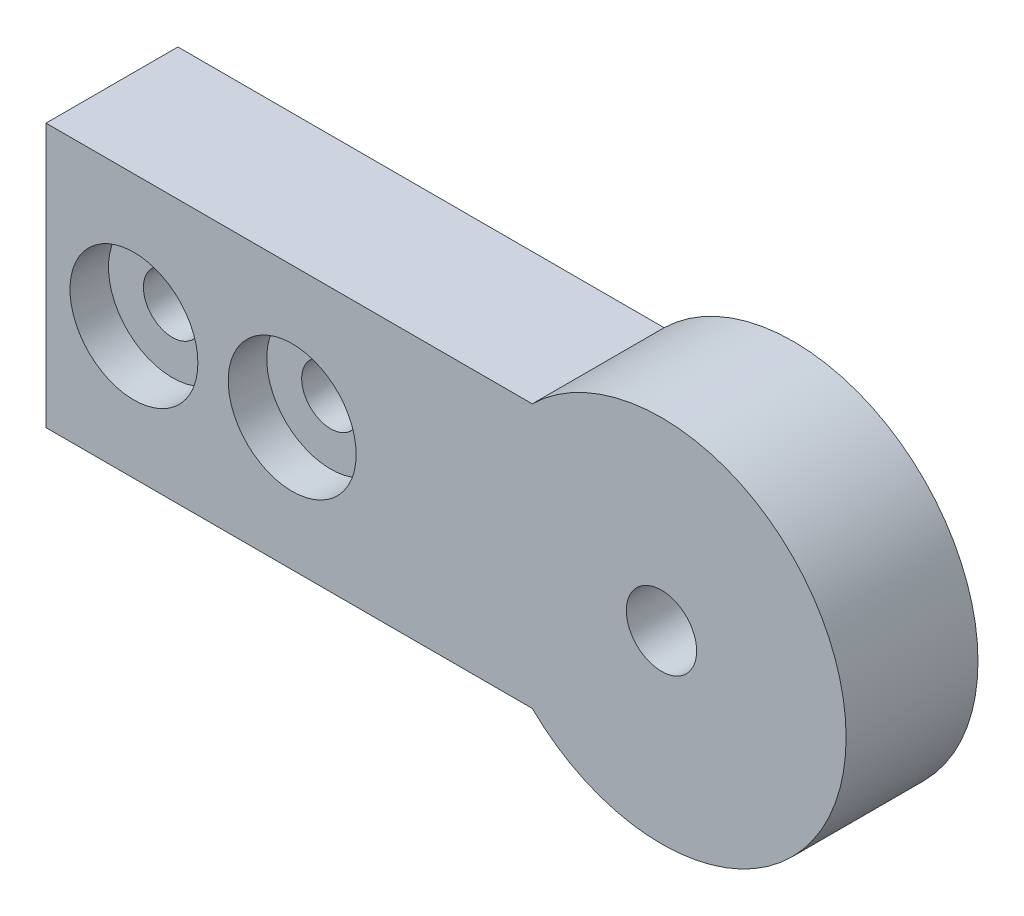
ISO-10303-21;
HEADER;
FILE_DESCRIPTION(('STEP AP214'),'2;1');
FILE_NAME('part.step','',(''),(''),'','','');
FILE_SCHEMA(('AUTOMOTIVE_DESIGN { 1 0 10303 214 1 1 1 1 }'));
ENDSEC;
DATA;
#1=APPLICATION_CONTEXT('core data for automotive mechanical design processes');
#2=APPLICATION_PROTOCOL_DEFINITION('international standard','automotive_design',2000,#1);
#3=PRODUCT_CONTEXT('',#1,'mechanical');
#4=PRODUCT('Part','Part','',(#3));
#5=PRODUCT_RELATED_PRODUCT_CATEGORY('part','',(#4));
#6=PRODUCT_DEFINITION_FORMATION('','',#4);
#7=PRODUCT_DEFINITION_CONTEXT('part definition',#1,'design');
#8=PRODUCT_DEFINITION('design','',#6,#7);
#9=PRODUCT_DEFINITION_SHAPE('','',#8);
#10=(LENGTH_UNIT() NAMED_UNIT(*) SI_UNIT(.MILLI.,.METRE.));
#11=(NAMED_UNIT(*) PLANE_ANGLE_UNIT() SI_UNIT($,.RADIAN.));
#12=(NAMED_UNIT(*) SI_UNIT($,.STERADIAN.) SOLID_ANGLE_UNIT());
#13=UNCERTAINTY_MEASURE_WITH_UNIT(LENGTH_MEASURE(1.E-05),#10,'distance_accuracy_value','');
#14=(GEOMETRIC_REPRESENTATION_CONTEXT(3) GLOBAL_UNCERTAINTY_ASSIGNED_CONTEXT((#13)) GLOBAL_UNIT_ASSIGNED_CONTEXT((#10,
#11,#12)) REPRESENTATION_CONTEXT('',''));
#15=CARTESIAN_POINT('',(0.,0.,0.));
#16=DIRECTION('',(0.,0.,1.));
#17=DIRECTION('',(1.,0.,0.));
#18=AXIS2_PLACEMENT_3D('',#15,#16,#17);
#19=CARTESIAN_POINT('',(0.,0.,15.));
#20=DIRECTION('',(0.,0.,-1.));
#21=DIRECTION('',(-1.,0.,0.));
#22=AXIS2_PLACEMENT_3D('',#19,#20,#21);
#23=CYLINDRICAL_SURFACE('',#22,21.);
#24=CARTESIAN_POINT('',(0.,0.,0.));
#25=DIRECTION('',(0.,0.,1.));
#26=DIRECTION('',(1.,0.,0.));
#27=AXIS2_PLACEMENT_3D('',#24,#25,#26);
#28=CIRCLE('',#27,21.);
#29=CARTESIAN_POINT('',(-14.6969384566991,-15.,0.));
#30=VERTEX_POINT('',#29);
#31=CARTESIAN_POINT('',(-14.6969384566991,15.,0.));
#32=VERTEX_POINT('',#31);
#33=EDGE_CURVE('E110',#30,#32,#28,.T.);
#34=ORIENTED_EDGE('',*,*,#33,.T.);
#35=DIRECTION('',(0.,0.,-1.));
#36=VECTOR('',#35,1.);
#37=CARTESIAN_POINT('',(-14.6969384566991,15.,15.));
#38=LINE('',#37,#36);
#39=CARTESIAN_POINT('',(-14.6969384566991,15.,15.));
#40=VERTEX_POINT('',#39);
#41=EDGE_CURVE('E11',#40,#32,#38,.T.);
#42=ORIENTED_EDGE('',*,*,#41,.F.);
#43=CARTESIAN_POINT('',(0.,0.,15.));
#44=DIRECTION('',(0.,0.,1.));
#45=DIRECTION('',(1.,0.,0.));
#46=AXIS2_PLACEMENT_3D('',#43,#44,#45);
#47=CIRCLE('',#46,21.);
#48=CARTESIAN_POINT('',(-14.6969384566991,-15.,15.));
#49=VERTEX_POINT('',#48);
#50=EDGE_CURVE('E94',#49,#40,#47,.T.);
#51=ORIENTED_EDGE('',*,*,#50,.F.);
#52=DIRECTION('',(0.,0.,-1.));
#53=VECTOR('',#52,1.);
#54=CARTESIAN_POINT('',(-14.6969384566991,-15.,15.));
#55=LINE('',#54,#53);
#56=EDGE_CURVE('E106',#49,#30,#55,.T.);
#57=ORIENTED_EDGE('',*,*,#56,.T.);
#58=EDGE_LOOP('',(#34,#42,#51,#57));
#59=FACE_BOUND('',#58,.T.);
#60=ADVANCED_FACE('F42',(#59),#23,.T.);
#61=CARTESIAN_POINT('',(-14.6969384566991,15.,15.));
#62=DIRECTION('',(0.,-1.,0.));
#63=DIRECTION('',(1.,0.,0.));
#64=AXIS2_PLACEMENT_3D('',#61,#62,#63);
#65=PLANE('',#64);
#66=DIRECTION('',(-1.,0.,0.));
#67=VECTOR('',#66,1.);
#68=CARTESIAN_POINT('',(-14.6969384566991,15.,0.));
#69=LINE('',#68,#67);
#70=CARTESIAN_POINT('',(-70.,15.,0.));
#71=VERTEX_POINT('',#70);
#72=EDGE_CURVE('E99',#32,#71,#69,.T.);
#73=ORIENTED_EDGE('',*,*,#72,.T.);
#74=DIRECTION('',(0.,0.,-1.));
#75=VECTOR('',#74,1.);
#76=CARTESIAN_POINT('',(-70.,15.,15.));
#77=LINE('',#76,#75);
#78=CARTESIAN_POINT('',(-70.,15.,15.));
#79=VERTEX_POINT('',#78);
#80=EDGE_CURVE('E51',#79,#71,#77,.T.);
#81=ORIENTED_EDGE('',*,*,#80,.F.);
#82=DIRECTION('',(-1.,0.,0.));
#83=VECTOR('',#82,1.);
#84=CARTESIAN_POINT('',(-14.6969384566991,15.,15.));
#85=LINE('',#84,#83);
#86=EDGE_CURVE('E89',#40,#79,#85,.T.);
#87=ORIENTED_EDGE('',*,*,#86,.F.);
#88=ORIENTED_EDGE('',*,*,#41,.T.);
#89=EDGE_LOOP('',(#73,#81,#87,#88));
#90=FACE_BOUND('',#89,.T.);
#91=ADVANCED_FACE('F98',(#90),#65,.F.);
#92=CARTESIAN_POINT('',(-70.,15.,15.));
#93=DIRECTION('',(1.,0.,0.));
#94=DIRECTION('',(0.,0.,-1.));
#95=AXIS2_PLACEMENT_3D('',#92,#93,#94);
#96=PLANE('',#95);
#97=DIRECTION('',(0.,-1.,0.));
#98=VECTOR('',#97,1.);
#99=CARTESIAN_POINT('',(-70.,15.,0.));
#100=LINE('',#99,#98);
#101=CARTESIAN_POINT('',(-70.,-15.,0.));
#102=VERTEX_POINT('',#101);
#103=EDGE_CURVE('E76',#71,#102,#100,.T.);
#104=ORIENTED_EDGE('',*,*,#103,.T.);
#105=DIRECTION('',(0.,0.,-1.));
#106=VECTOR('',#105,1.);
#107=CARTESIAN_POINT('',(-70.,-15.,15.));
#108=LINE('',#107,#106);
#109=CARTESIAN_POINT('',(-70.,-15.,15.));
#110=VERTEX_POINT('',#109);
#111=EDGE_CURVE('E101',#110,#102,#108,.T.);
#112=ORIENTED_EDGE('',*,*,#111,.F.);
#113=DIRECTION('',(0.,-1.,0.));
#114=VECTOR('',#113,1.);
#115=CARTESIAN_POINT('',(-70.,15.,15.));
#116=LINE('',#115,#114);
#117=EDGE_CURVE('E92',#79,#110,#116,.T.);
#118=ORIENTED_EDGE('',*,*,#117,.F.);
#119=ORIENTED_EDGE('',*,*,#80,.T.);
#120=EDGE_LOOP('',(#104,#112,#118,#119));
#121=FACE_BOUND('',#120,.T.);
#122=ADVANCED_FACE('F102',(#121),#96,.F.);
#123=CARTESIAN_POINT('',(-14.6969384566991,-15.,15.));
#124=DIRECTION('',(0.,1.,0.));
#125=DIRECTION('',(-1.,0.,0.));
#126=AXIS2_PLACEMENT_3D('',#123,#124,#125);
#127=PLANE('',#126);
#128=DIRECTION('',(1.,0.,0.));
#129=VECTOR('',#128,1.);
#130=CARTESIAN_POINT('',(-14.6969384566991,-15.,0.));
#131=LINE('',#130,#129);
#132=EDGE_CURVE('E82',#102,#30,#131,.T.);
#133=ORIENTED_EDGE('',*,*,#132,.T.);
#134=ORIENTED_EDGE('',*,*,#56,.F.);
#135=DIRECTION('',(1.,0.,0.));
#136=VECTOR('',#135,1.);
#137=CARTESIAN_POINT('',(-14.6969384566991,-15.,15.));
#138=LINE('',#137,#136);
#139=EDGE_CURVE('E59',#110,#49,#138,.T.);
#140=ORIENTED_EDGE('',*,*,#139,.F.);
#141=ORIENTED_EDGE('',*,*,#111,.T.);
#142=EDGE_LOOP('',(#133,#134,#140,#141));
#143=FACE_BOUND('',#142,.T.);
#144=ADVANCED_FACE('F124',(#143),#127,.F.);
#145=CARTESIAN_POINT('',(0.,0.,15.));
#146=DIRECTION('',(0.,0.,1.));
#147=DIRECTION('',(1.,0.,0.));
#148=AXIS2_PLACEMENT_3D('',#145,#146,#147);
#149=PLANE('',#148);
#150=CARTESIAN_POINT('',(0.,0.,15.));
#151=DIRECTION('',(0.,0.,1.));
#152=DIRECTION('',(1.,0.,0.));
#153=AXIS2_PLACEMENT_3D('',#150,#151,#152);
#154=CIRCLE('',#153,4.);
#155=CARTESIAN_POINT('',(4.,0.,15.));
#156=VERTEX_POINT('',#155);
#157=EDGE_CURVE('E166',#156,#156,#154,.T.);
#158=ORIENTED_EDGE('',*,*,#157,.F.);
#159=EDGE_LOOP('',(#158));
#160=FACE_BOUND('',#159,.T.);
#161=CARTESIAN_POINT('',(-60.,0.,15.));
#162=DIRECTION('',(0.,0.,1.));
#163=DIRECTION('',(1.,0.,0.));
#164=AXIS2_PLACEMENT_3D('',#161,#162,#163);
#165=CIRCLE('',#164,7.275);
#166=CARTESIAN_POINT('',(-52.725,0.,15.));
#167=VERTEX_POINT('',#166);
#168=EDGE_CURVE('E158',#167,#167,#165,.T.);
#169=ORIENTED_EDGE('',*,*,#168,.F.);
#170=EDGE_LOOP('',(#169));
#171=FACE_BOUND('',#170,.T.);
#172=CARTESIAN_POINT('',(-42.,0.,15.));
#173=DIRECTION('',(0.,0.,1.));
#174=DIRECTION('',(1.,0.,0.));
#175=AXIS2_PLACEMENT_3D('',#172,#173,#174);
#176=CIRCLE('',#175,7.275);
#177=CARTESIAN_POINT('',(-34.725,0.,15.));
#178=VERTEX_POINT('',#177);
#179=EDGE_CURVE('E142',#178,#178,#176,.T.);
#180=ORIENTED_EDGE('',*,*,#179,.F.);
#181=EDGE_LOOP('',(#180));
#182=FACE_BOUND('',#181,.T.);
#183=ORIENTED_EDGE('',*,*,#50,.T.);
#184=ORIENTED_EDGE('',*,*,#86,.T.);
#185=ORIENTED_EDGE('',*,*,#117,.T.);
#186=ORIENTED_EDGE('',*,*,#139,.T.);
#187=EDGE_LOOP('',(#183,#184,#185,#186));
#188=FACE_BOUND('',#187,.T.);
#189=ADVANCED_FACE('F90',(#160,#171,#182,#188),#149,.T.);
#190=CARTESIAN_POINT('',(0.,0.,0.));
#191=DIRECTION('',(0.,0.,1.));
#192=DIRECTION('',(1.,0.,0.));
#193=AXIS2_PLACEMENT_3D('',#190,#191,#192);
#194=PLANE('',#193);
#195=CARTESIAN_POINT('',(0.,0.,0.));
#196=DIRECTION('',(0.,0.,1.));
#197=DIRECTION('',(1.,0.,0.));
#198=AXIS2_PLACEMENT_3D('',#195,#196,#197);
#199=CIRCLE('',#198,4.);
#200=CARTESIAN_POINT('',(4.,0.,0.));
#201=VERTEX_POINT('',#200);
#202=EDGE_CURVE('E162',#201,#201,#199,.F.);
#203=ORIENTED_EDGE('',*,*,#202,.F.);
#204=EDGE_LOOP('',(#203));
#205=FACE_BOUND('',#204,.T.);
#206=CARTESIAN_POINT('',(-60.,0.,0.));
#207=DIRECTION('',(0.,0.,1.));
#208=DIRECTION('',(1.,0.,0.));
#209=AXIS2_PLACEMENT_3D('',#206,#207,#208);
#210=CIRCLE('',#209,3.3);
#211=CARTESIAN_POINT('',(-56.7,0.,0.));
#212=VERTEX_POINT('',#211);
#213=EDGE_CURVE('E146',#212,#212,#210,.T.);
#214=ORIENTED_EDGE('',*,*,#213,.T.);
#215=EDGE_LOOP('',(#214));
#216=FACE_BOUND('',#215,.T.);
#217=CARTESIAN_POINT('',(-42.,0.,0.));
#218=DIRECTION('',(0.,0.,1.));
#219=DIRECTION('',(1.,0.,0.));
#220=AXIS2_PLACEMENT_3D('',#217,#218,#219);
#221=CIRCLE('',#220,3.3);
#222=CARTESIAN_POINT('',(-38.7,0.,0.));
#223=VERTEX_POINT('',#222);
#224=EDGE_CURVE('E114',#223,#223,#221,.T.);
#225=ORIENTED_EDGE('',*,*,#224,.T.);
#226=EDGE_LOOP('',(#225));
#227=FACE_BOUND('',#226,.T.);
#228=ORIENTED_EDGE('',*,*,#33,.F.);
#229=ORIENTED_EDGE('',*,*,#132,.F.);
#230=ORIENTED_EDGE('',*,*,#103,.F.);
#231=ORIENTED_EDGE('',*,*,#72,.F.);
#232=EDGE_LOOP('',(#228,#229,#230,#231));
#233=FACE_BOUND('',#232,.T.);
#234=ADVANCED_FACE('F127',(#205,#216,#227,#233),#194,.F.);
#235=CARTESIAN_POINT('',(-42.,0.,15.));
#236=DIRECTION('',(0.,0.,1.));
#237=DIRECTION('',(1.,0.,0.));
#238=AXIS2_PLACEMENT_3D('',#235,#236,#237);
#239=CYLINDRICAL_SURFACE('',#238,3.3);
#240=ORIENTED_EDGE('',*,*,#224,.F.);
#241=EDGE_LOOP('',(#240));
#242=FACE_BOUND('',#241,.T.);
#243=CARTESIAN_POINT('',(-42.,0.,10.62));
#244=DIRECTION('',(0.,0.,1.));
#245=DIRECTION('',(1.,0.,0.));
#246=AXIS2_PLACEMENT_3D('',#243,#244,#245);
#247=CIRCLE('',#246,3.3);
#248=CARTESIAN_POINT('',(-38.7,0.,10.62));
#249=VERTEX_POINT('',#248);
#250=EDGE_CURVE('E134',#249,#249,#247,.T.);
#251=ORIENTED_EDGE('',*,*,#250,.T.);
#252=EDGE_LOOP('',(#251));
#253=FACE_BOUND('',#252,.T.);
#254=ADVANCED_FACE('F194',(#242,#253),#239,.F.);
#255=CARTESIAN_POINT('',(-38.7,0.,10.62));
#256=DIRECTION('',(0.,0.,-1.));
#257=DIRECTION('',(-1.,0.,0.));
#258=AXIS2_PLACEMENT_3D('',#255,#256,#257);
#259=PLANE('',#258);
#260=ORIENTED_EDGE('',*,*,#250,.F.);
#261=EDGE_LOOP('',(#260));
#262=FACE_BOUND('',#261,.T.);
#263=CARTESIAN_POINT('',(-42.,0.,10.62));
#264=DIRECTION('',(0.,0.,1.));
#265=DIRECTION('',(1.,0.,0.));
#266=AXIS2_PLACEMENT_3D('',#263,#264,#265);
#267=CIRCLE('',#266,7.275);
#268=CARTESIAN_POINT('',(-34.725,0.,10.62));
#269=VERTEX_POINT('',#268);
#270=EDGE_CURVE('E138',#269,#269,#267,.T.);
#271=ORIENTED_EDGE('',*,*,#270,.T.);
#272=EDGE_LOOP('',(#271));
#273=FACE_BOUND('',#272,.T.);
#274=ADVANCED_FACE('F184',(#262,#273),#259,.F.);
#275=CARTESIAN_POINT('',(-42.,0.,15.));
#276=DIRECTION('',(0.,0.,1.));
#277=DIRECTION('',(1.,0.,0.));
#278=AXIS2_PLACEMENT_3D('',#275,#276,#277);
#279=CYLINDRICAL_SURFACE('',#278,7.275);
#280=ORIENTED_EDGE('',*,*,#270,.F.);
#281=EDGE_LOOP('',(#280));
#282=FACE_BOUND('',#281,.T.);
#283=ORIENTED_EDGE('',*,*,#179,.T.);
#284=EDGE_LOOP('',(#283));
#285=FACE_BOUND('',#284,.T.);
#286=ADVANCED_FACE('F181',(#282,#285),#279,.F.);
#287=CARTESIAN_POINT('',(-60.,0.,15.));
#288=DIRECTION('',(0.,0.,1.));
#289=DIRECTION('',(1.,0.,0.));
#290=AXIS2_PLACEMENT_3D('',#287,#288,#289);
#291=CYLINDRICAL_SURFACE('',#290,3.3);
#292=ORIENTED_EDGE('',*,*,#213,.F.);
#293=EDGE_LOOP('',(#292));
#294=FACE_BOUND('',#293,.T.);
#295=CARTESIAN_POINT('',(-60.,0.,10.62));
#296=DIRECTION('',(0.,0.,1.));
#297=DIRECTION('',(1.,0.,0.));
#298=AXIS2_PLACEMENT_3D('',#295,#296,#297);
#299=CIRCLE('',#298,3.3);
#300=CARTESIAN_POINT('',(-56.7,0.,10.62));
#301=VERTEX_POINT('',#300);
#302=EDGE_CURVE('E150',#301,#301,#299,.T.);
#303=ORIENTED_EDGE('',*,*,#302,.T.);
#304=EDGE_LOOP('',(#303));
#305=FACE_BOUND('',#304,.T.);
#306=ADVANCED_FACE('F183',(#294,#305),#291,.F.);
#307=CARTESIAN_POINT('',(-56.7,0.,10.62));
#308=DIRECTION('',(0.,0.,-1.));
#309=DIRECTION('',(-1.,0.,0.));
#310=AXIS2_PLACEMENT_3D('',#307,#308,#309);
#311=PLANE('',#310);
#312=ORIENTED_EDGE('',*,*,#302,.F.);
#313=EDGE_LOOP('',(#312));
#314=FACE_BOUND('',#313,.T.);
#315=CARTESIAN_POINT('',(-60.,0.,10.62));
#316=DIRECTION('',(0.,0.,1.));
#317=DIRECTION('',(1.,0.,0.));
#318=AXIS2_PLACEMENT_3D('',#315,#316,#317);
#319=CIRCLE('',#318,7.275);
#320=CARTESIAN_POINT('',(-52.725,0.,10.62));
#321=VERTEX_POINT('',#320);
#322=EDGE_CURVE('E154',#321,#321,#319,.T.);
#323=ORIENTED_EDGE('',*,*,#322,.T.);
#324=EDGE_LOOP('',(#323));
#325=FACE_BOUND('',#324,.T.);
#326=ADVANCED_FACE('F191',(#314,#325),#311,.F.);
#327=CARTESIAN_POINT('',(-60.,0.,15.));
#328=DIRECTION('',(0.,0.,1.));
#329=DIRECTION('',(1.,0.,0.));
#330=AXIS2_PLACEMENT_3D('',#327,#328,#329);
#331=CYLINDRICAL_SURFACE('',#330,7.275);
#332=ORIENTED_EDGE('',*,*,#322,.F.);
#333=EDGE_LOOP('',(#332));
#334=FACE_BOUND('',#333,.T.);
#335=ORIENTED_EDGE('',*,*,#168,.T.);
#336=EDGE_LOOP('',(#335));
#337=FACE_BOUND('',#336,.T.);
#338=ADVANCED_FACE('F252',(#334,#337),#331,.F.);
#339=CARTESIAN_POINT('',(0.,0.,-0.000999999999999265));
#340=DIRECTION('',(0.,0.,1.));
#341=DIRECTION('',(1.,0.,0.));
#342=AXIS2_PLACEMENT_3D('',#339,#340,#341);
#343=CYLINDRICAL_SURFACE('',#342,4.);
#344=CARTESIAN_POINT('',(4.,0.,15.));
#345=CARTESIAN_POINT('',(4.,0.,14.84375));
#346=CARTESIAN_POINT('',(4.,0.,14.6875));
#347=CARTESIAN_POINT('',(4.,0.,14.375));
#348=CARTESIAN_POINT('',(4.,0.,14.21875));
#349=CARTESIAN_POINT('',(4.,0.,13.90625));
#350=CARTESIAN_POINT('',(4.,0.,13.75));
#351=CARTESIAN_POINT('',(4.,0.,13.4375));
#352=CARTESIAN_POINT('',(4.,0.,13.28125));
#353=CARTESIAN_POINT('',(4.,0.,12.96875));
#354=CARTESIAN_POINT('',(4.,0.,12.8125));
#355=CARTESIAN_POINT('',(4.,0.,12.5));
#356=CARTESIAN_POINT('',(4.,0.,12.34375));
#357=CARTESIAN_POINT('',(4.,0.,12.03125));
#358=CARTESIAN_POINT('',(4.,0.,11.875));
#359=CARTESIAN_POINT('',(4.,0.,11.5625));
#360=CARTESIAN_POINT('',(4.,0.,11.40625));
#361=CARTESIAN_POINT('',(4.,0.,11.09375));
#362=CARTESIAN_POINT('',(4.,0.,10.9375));
#363=CARTESIAN_POINT('',(4.,0.,10.625));
#364=CARTESIAN_POINT('',(4.,0.,10.46875));
#365=CARTESIAN_POINT('',(4.,0.,10.15625));
#366=CARTESIAN_POINT('',(4.,0.,10.));
#367=CARTESIAN_POINT('',(4.,0.,9.6875));
#368=CARTESIAN_POINT('',(4.,0.,9.53125));
#369=CARTESIAN_POINT('',(4.,0.,9.21875));
#370=CARTESIAN_POINT('',(4.,0.,9.0625));
#371=CARTESIAN_POINT('',(4.,0.,8.75));
#372=CARTESIAN_POINT('',(4.,0.,8.59375));
#373=CARTESIAN_POINT('',(4.,0.,8.28125));
#374=CARTESIAN_POINT('',(4.,0.,8.125));
#375=CARTESIAN_POINT('',(4.,0.,7.8125));
#376=CARTESIAN_POINT('',(4.,0.,7.65625));
#377=CARTESIAN_POINT('',(4.,0.,7.34375));
#378=CARTESIAN_POINT('',(4.,0.,7.1875));
#379=CARTESIAN_POINT('',(4.,0.,6.875));
#380=CARTESIAN_POINT('',(4.,0.,6.71875));
#381=CARTESIAN_POINT('',(4.,0.,6.40625));
#382=CARTESIAN_POINT('',(4.,0.,6.25));
#383=CARTESIAN_POINT('',(4.,0.,5.9375));
#384=CARTESIAN_POINT('',(4.,0.,5.78125));
#385=CARTESIAN_POINT('',(4.,0.,5.46875));
#386=CARTESIAN_POINT('',(4.,0.,5.3125));
#387=CARTESIAN_POINT('',(4.,0.,5.));
#388=CARTESIAN_POINT('',(4.,0.,4.84375));
#389=CARTESIAN_POINT('',(4.,0.,4.53125));
#390=CARTESIAN_POINT('',(4.,0.,4.375));
#391=CARTESIAN_POINT('',(4.,0.,4.0625));
#392=CARTESIAN_POINT('',(4.,0.,3.90625));
#393=CARTESIAN_POINT('',(4.,0.,3.59375));
#394=CARTESIAN_POINT('',(4.,0.,3.4375));
#395=CARTESIAN_POINT('',(4.,0.,3.125));
#396=CARTESIAN_POINT('',(4.,0.,2.96875));
#397=CARTESIAN_POINT('',(4.,0.,2.65625));
#398=CARTESIAN_POINT('',(4.,0.,2.5));
#399=CARTESIAN_POINT('',(4.,0.,2.1875));
#400=CARTESIAN_POINT('',(4.,0.,2.03125));
#401=CARTESIAN_POINT('',(4.,0.,1.71875));
#402=CARTESIAN_POINT('',(4.,0.,1.5625));
#403=CARTESIAN_POINT('',(4.,0.,1.25));
#404=CARTESIAN_POINT('',(4.,0.,1.09375));
#405=CARTESIAN_POINT('',(4.,0.,0.781250000000001));
#406=CARTESIAN_POINT('',(4.,0.,0.625));
#407=CARTESIAN_POINT('',(4.,0.,0.3125));
#408=CARTESIAN_POINT('',(4.,0.,0.15625));
#409=CARTESIAN_POINT('',(4.,0.,0.));
#410=B_SPLINE_CURVE_WITH_KNOTS('',3,(#344,#345,#346,#347,#348,#349,#350,#351,#352,#353,#354,
#355,#356,#357,#358,#359,#360,#361,#362,#363,#364,#365,#366,#367,#368,#369,#370,#371,#372,#373,
#374,#375,#376,#377,#378,#379,#380,#381,#382,#383,#384,#385,#386,#387,#388,#389,#390,#391,#392,
#393,#394,#395,#396,#397,#398,#399,#400,#401,#402,#403,#404,#405,#406,#407,#408,#409),
.UNSPECIFIED.,.F.,.F.,(4,2,2,2,2,2,2,2,2,2,2,2,2,2,2,2,2,2,2,2,2,2,2,2,2,2,2,2,2,2,2,2,4),(0.,
0.46875,0.937500000000001,1.40625,1.875,2.34375,2.8125,3.28125,3.75,4.21875,4.6875,5.15625,
5.625,6.09375,6.5625,7.03125,7.5,7.96875,8.4375,8.90625,9.375,9.84375,10.3125,10.78125,11.25,
11.71875,12.1875,12.65625,13.125,13.59375,14.0625,14.53125,15.),.UNSPECIFIED.);
#411=EDGE_CURVE('BSEAM171',#156,#201,#410,.T.);
#412=ORIENTED_EDGE('',*,*,#157,.T.);
#413=ORIENTED_EDGE('',*,*,#202,.T.);
#414=ORIENTED_EDGE('',*,*,#411,.T.);
#415=ORIENTED_EDGE('',*,*,#411,.F.);
#416=EDGE_LOOP('',(#412,#414,#413,#415));
#417=FACE_BOUND('',#416,.T.);
#418=ADVANCED_FACE('F171',(#417),#343,.F.);
#419=CLOSED_SHELL('',(#60,#91,#122,#144,#189,#234,#254,#274,#286,#306,#326,#338,#418));
#420=MANIFOLD_SOLID_BREP('B2',#419);
#421=ADVANCED_BREP_SHAPE_REPRESENTATION('',(#18,#420),#14);
#422=SHAPE_DEFINITION_REPRESENTATION(#9,#421);
ENDSEC;
END-ISO-10303-21;
